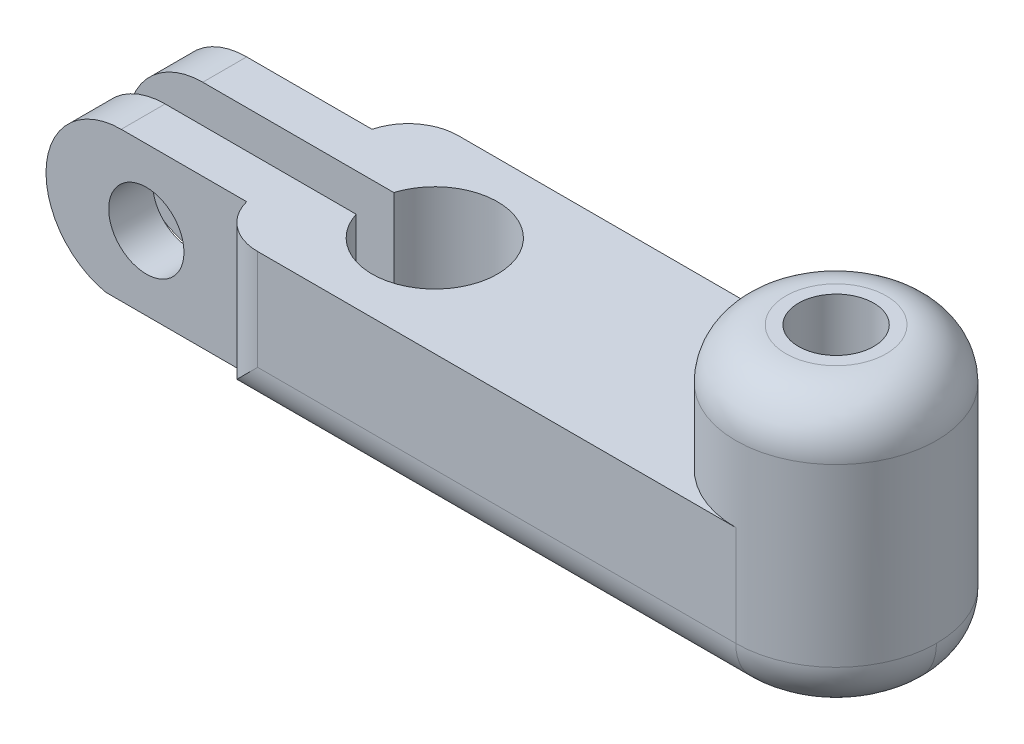
ISO-10303-21;
HEADER;
FILE_DESCRIPTION(('STEP AP214'),'2;1');
FILE_NAME('part.step','',(''),(''),'','','');
FILE_SCHEMA(('AUTOMOTIVE_DESIGN { 1 0 10303 214 1 1 1 1 }'));
ENDSEC;
DATA;
#1=APPLICATION_CONTEXT('core data for automotive mechanical design processes');
#2=APPLICATION_PROTOCOL_DEFINITION('international standard','automotive_design',2000,#1);
#3=PRODUCT_CONTEXT('',#1,'mechanical');
#4=PRODUCT('Part','Part','',(#3));
#5=PRODUCT_RELATED_PRODUCT_CATEGORY('part','',(#4));
#6=PRODUCT_DEFINITION_FORMATION('','',#4);
#7=PRODUCT_DEFINITION_CONTEXT('part definition',#1,'design');
#8=PRODUCT_DEFINITION('design','',#6,#7);
#9=PRODUCT_DEFINITION_SHAPE('','',#8);
#10=(LENGTH_UNIT() NAMED_UNIT(*) SI_UNIT(.MILLI.,.METRE.));
#11=(NAMED_UNIT(*) PLANE_ANGLE_UNIT() SI_UNIT($,.RADIAN.));
#12=(NAMED_UNIT(*) SI_UNIT($,.STERADIAN.) SOLID_ANGLE_UNIT());
#13=UNCERTAINTY_MEASURE_WITH_UNIT(LENGTH_MEASURE(1.E-05),#10,'distance_accuracy_value','');
#14=(GEOMETRIC_REPRESENTATION_CONTEXT(3) GLOBAL_UNCERTAINTY_ASSIGNED_CONTEXT((#13)) GLOBAL_UNIT_ASSIGNED_CONTEXT((#10,
#11,#12)) REPRESENTATION_CONTEXT('',''));
#15=CARTESIAN_POINT('',(0.,0.,0.));
#16=DIRECTION('',(0.,0.,1.));
#17=DIRECTION('',(1.,0.,0.));
#18=AXIS2_PLACEMENT_3D('',#15,#16,#17);
#19=CARTESIAN_POINT('',(0.,0.,0.));
#20=DIRECTION('',(0.,-1.,0.));
#21=DIRECTION('',(0.,0.,-1.));
#22=AXIS2_PLACEMENT_3D('',#19,#20,#21);
#23=PLANE('',#22);
#24=DIRECTION('',(0.,0.,1.));
#25=VECTOR('',#24,1.);
#26=CARTESIAN_POINT('',(-30.,0.,-6.5));
#27=LINE('',#26,#25);
#28=CARTESIAN_POINT('',(-30.,0.,-4.75));
#29=VERTEX_POINT('',#28);
#30=CARTESIAN_POINT('',(-30.,0.,-6.));
#31=VERTEX_POINT('',#30);
#32=EDGE_CURVE('E321',#29,#31,#27,.F.);
#33=ORIENTED_EDGE('',*,*,#32,.T.);
#34=DIRECTION('',(-1.,0.,0.));
#35=VECTOR('',#34,1.);
#36=CARTESIAN_POINT('',(-4.,0.,-6.));
#37=LINE('',#36,#35);
#38=CARTESIAN_POINT('',(-21.5,0.,-6.));
#39=VERTEX_POINT('',#38);
#40=EDGE_CURVE('E323',#31,#39,#37,.F.);
#41=ORIENTED_EDGE('',*,*,#40,.T.);
#42=CARTESIAN_POINT('',(-20.,0.,-4.));
#43=DIRECTION('',(0.,1.,0.));
#44=DIRECTION('',(0.,0.,1.));
#45=AXIS2_PLACEMENT_3D('',#42,#43,#44);
#46=CIRCLE('',#45,2.5);
#47=CARTESIAN_POINT('',(-22.3848480035424,0.,-4.75));
#48=VERTEX_POINT('',#47);
#49=EDGE_CURVE('E380',#39,#48,#46,.T.);
#50=ORIENTED_EDGE('',*,*,#49,.T.);
#51=DIRECTION('',(-1.,0.,0.));
#52=VECTOR('',#51,1.);
#53=CARTESIAN_POINT('',(-33.,0.,-4.75));
#54=LINE('',#53,#52);
#55=EDGE_CURVE('E326',#48,#29,#54,.T.);
#56=ORIENTED_EDGE('',*,*,#55,.T.);
#57=EDGE_LOOP('',(#33,#41,#50,#56));
#58=FACE_BOUND('',#57,.T.);
#59=ADVANCED_FACE('F34',(#58),#23,.T.);
#60=CARTESIAN_POINT('',(-18.5,0.,-2.));
#61=VERTEX_POINT('',#60);
#62=CARTESIAN_POINT('',(-18.5,0.,-6.));
#63=VERTEX_POINT('',#62);
#64=EDGE_CURVE('E379',#61,#63,#46,.T.);
#65=ORIENTED_EDGE('',*,*,#64,.T.);
#66=DIRECTION('',(-1.,0.,0.));
#67=VECTOR('',#66,1.);
#68=CARTESIAN_POINT('',(-4.,0.,-6.));
#69=LINE('',#68,#67);
#70=CARTESIAN_POINT('',(-4.,0.,-6.));
#71=VERTEX_POINT('',#70);
#72=EDGE_CURVE('E336',#63,#71,#69,.F.);
#73=ORIENTED_EDGE('',*,*,#72,.T.);
#74=CARTESIAN_POINT('',(-4.,0.,-4.));
#75=DIRECTION('',(0.,-1.,0.));
#76=DIRECTION('',(0.,0.,-1.));
#77=AXIS2_PLACEMENT_3D('',#74,#75,#76);
#78=CIRCLE('',#77,2.);
#79=CARTESIAN_POINT('',(-2.,0.,-4.));
#80=VERTEX_POINT('',#79);
#81=EDGE_CURVE('E337',#71,#80,#78,.T.);
#82=ORIENTED_EDGE('',*,*,#81,.T.);
#83=CARTESIAN_POINT('',(-4.,0.,-4.));
#84=DIRECTION('',(0.,-1.,0.));
#85=DIRECTION('',(0.,0.,-1.));
#86=AXIS2_PLACEMENT_3D('',#83,#84,#85);
#87=CIRCLE('',#86,2.);
#88=CARTESIAN_POINT('',(-4.,0.,-2.));
#89=VERTEX_POINT('',#88);
#90=EDGE_CURVE('E341',#80,#89,#87,.T.);
#91=ORIENTED_EDGE('',*,*,#90,.T.);
#92=DIRECTION('',(1.,0.,0.));
#93=VECTOR('',#92,1.);
#94=CARTESIAN_POINT('',(-25.,0.,-2.));
#95=LINE('',#94,#93);
#96=EDGE_CURVE('E342',#89,#61,#95,.F.);
#97=ORIENTED_EDGE('',*,*,#96,.T.);
#98=EDGE_LOOP('',(#65,#73,#82,#91,#97));
#99=FACE_BOUND('',#98,.T.);
#100=ADVANCED_FACE('F256',(#99),#23,.T.);
#101=CARTESIAN_POINT('',(0.,6.,0.));
#102=DIRECTION('',(0.,-1.,0.));
#103=DIRECTION('',(0.,0.,-1.));
#104=AXIS2_PLACEMENT_3D('',#101,#102,#103);
#105=PLANE('',#104);
#106=DIRECTION('',(-1.,0.,0.));
#107=VECTOR('',#106,1.);
#108=CARTESIAN_POINT('',(-25.,6.,-8.));
#109=LINE('',#108,#107);
#110=CARTESIAN_POINT('',(-4.,6.,-8.));
#111=VERTEX_POINT('',#110);
#112=CARTESIAN_POINT('',(-23.0635083268963,6.,-8.));
#113=VERTEX_POINT('',#112);
#114=EDGE_CURVE('E399',#111,#113,#109,.T.);
#115=ORIENTED_EDGE('',*,*,#114,.T.);
#116=CARTESIAN_POINT('',(-23.0635083268963,6.,-6.));
#117=DIRECTION('',(0.,-1.,0.));
#118=DIRECTION('',(0.,0.,-1.));
#119=AXIS2_PLACEMENT_3D('',#116,#117,#118);
#120=CIRCLE('',#119,2.);
#121=CARTESIAN_POINT('',(-25.,6.,-6.5));
#122=VERTEX_POINT('',#121);
#123=EDGE_CURVE('E43',#113,#122,#120,.F.);
#124=ORIENTED_EDGE('',*,*,#123,.T.);
#125=DIRECTION('',(-1.,0.,0.));
#126=VECTOR('',#125,1.);
#127=CARTESIAN_POINT('',(-33.,6.,-6.5));
#128=LINE('',#127,#126);
#129=CARTESIAN_POINT('',(-30.,6.,-6.5));
#130=VERTEX_POINT('',#129);
#131=EDGE_CURVE('E403',#122,#130,#128,.T.);
#132=ORIENTED_EDGE('',*,*,#131,.T.);
#133=DIRECTION('',(0.,0.,1.));
#134=VECTOR('',#133,1.);
#135=CARTESIAN_POINT('',(-30.,6.,0.));
#136=LINE('',#135,#134);
#137=CARTESIAN_POINT('',(-30.,6.,-4.75));
#138=VERTEX_POINT('',#137);
#139=EDGE_CURVE('E414',#130,#138,#136,.T.);
#140=ORIENTED_EDGE('',*,*,#139,.T.);
#141=DIRECTION('',(-1.,0.,0.));
#142=VECTOR('',#141,1.);
#143=CARTESIAN_POINT('',(-33.,6.,-4.75));
#144=LINE('',#143,#142);
#145=CARTESIAN_POINT('',(-22.3848480035424,6.,-4.75));
#146=VERTEX_POINT('',#145);
#147=EDGE_CURVE('E394',#146,#138,#144,.T.);
#148=ORIENTED_EDGE('',*,*,#147,.F.);
#149=CARTESIAN_POINT('',(-20.,6.,-4.));
#150=DIRECTION('',(0.,1.,0.));
#151=DIRECTION('',(0.,0.,1.));
#152=AXIS2_PLACEMENT_3D('',#149,#150,#151);
#153=CIRCLE('',#152,2.5);
#154=CARTESIAN_POINT('',(-22.3848480035424,6.,-3.25));
#155=VERTEX_POINT('',#154);
#156=EDGE_CURVE('E390',#155,#146,#153,.T.);
#157=ORIENTED_EDGE('',*,*,#156,.F.);
#158=DIRECTION('',(1.,0.,0.));
#159=VECTOR('',#158,1.);
#160=CARTESIAN_POINT('',(-33.,6.,-3.25));
#161=LINE('',#160,#159);
#162=CARTESIAN_POINT('',(-30.,6.,-3.25));
#163=VERTEX_POINT('',#162);
#164=EDGE_CURVE('E388',#163,#155,#161,.T.);
#165=ORIENTED_EDGE('',*,*,#164,.F.);
#166=DIRECTION('',(0.,0.,1.));
#167=VECTOR('',#166,1.);
#168=CARTESIAN_POINT('',(-30.,6.,0.));
#169=LINE('',#168,#167);
#170=CARTESIAN_POINT('',(-30.,6.,-1.5));
#171=VERTEX_POINT('',#170);
#172=EDGE_CURVE('E421',#163,#171,#169,.T.);
#173=ORIENTED_EDGE('',*,*,#172,.T.);
#174=DIRECTION('',(1.,0.,0.));
#175=VECTOR('',#174,1.);
#176=CARTESIAN_POINT('',(-25.,6.,-1.5));
#177=LINE('',#176,#175);
#178=CARTESIAN_POINT('',(-25.,6.,-1.5));
#179=VERTEX_POINT('',#178);
#180=EDGE_CURVE('E406',#171,#179,#177,.T.);
#181=ORIENTED_EDGE('',*,*,#180,.T.);
#182=CARTESIAN_POINT('',(-23.0635083268963,6.,-2.));
#183=DIRECTION('',(0.,-1.,0.));
#184=DIRECTION('',(0.,0.,-1.));
#185=AXIS2_PLACEMENT_3D('',#182,#183,#184);
#186=CIRCLE('',#185,2.);
#187=CARTESIAN_POINT('',(-23.0635083268963,6.,0.));
#188=VERTEX_POINT('',#187);
#189=EDGE_CURVE('E360',#179,#188,#186,.F.);
#190=ORIENTED_EDGE('',*,*,#189,.T.);
#191=DIRECTION('',(1.,0.,0.));
#192=VECTOR('',#191,1.);
#193=CARTESIAN_POINT('',(-25.,6.,0.));
#194=LINE('',#193,#192);
#195=CARTESIAN_POINT('',(-4.,6.,0.));
#196=VERTEX_POINT('',#195);
#197=EDGE_CURVE('E408',#188,#196,#194,.T.);
#198=ORIENTED_EDGE('',*,*,#197,.T.);
#199=CARTESIAN_POINT('',(-4.,6.,-4.));
#200=DIRECTION('',(0.,1.,0.));
#201=DIRECTION('',(0.,0.,1.));
#202=AXIS2_PLACEMENT_3D('',#199,#200,#201);
#203=CIRCLE('',#202,4.);
#204=EDGE_CURVE('E179',#111,#196,#203,.T.);
#205=ORIENTED_EDGE('',*,*,#204,.F.);
#206=EDGE_LOOP('',(#115,#124,#132,#140,#148,#157,#165,#173,#181,#190,#198,#205));
#207=FACE_BOUND('',#206,.T.);
#208=ADVANCED_FACE('F252',(#207),#105,.F.);
#209=CARTESIAN_POINT('',(-25.,6.,-8.));
#210=DIRECTION('',(0.,0.,1.));
#211=DIRECTION('',(1.,0.,0.));
#212=AXIS2_PLACEMENT_3D('',#209,#210,#211);
#213=PLANE('',#212);
#214=DIRECTION('',(0.,-1.,0.));
#215=VECTOR('',#214,1.);
#216=CARTESIAN_POINT('',(-4.,6.,-8.));
#217=LINE('',#216,#215);
#218=CARTESIAN_POINT('',(-4.,2.,-8.));
#219=VERTEX_POINT('',#218);
#220=EDGE_CURVE('E188',#111,#219,#217,.T.);
#221=ORIENTED_EDGE('',*,*,#220,.T.);
#222=DIRECTION('',(-1.,0.,0.));
#223=VECTOR('',#222,1.);
#224=CARTESIAN_POINT('',(-25.,2.,-8.));
#225=LINE('',#224,#223);
#226=CARTESIAN_POINT('',(-23.0635083268963,2.,-8.));
#227=VERTEX_POINT('',#226);
#228=EDGE_CURVE('E192',#219,#227,#225,.T.);
#229=ORIENTED_EDGE('',*,*,#228,.T.);
#230=DIRECTION('',(0.,-1.,0.));
#231=VECTOR('',#230,1.);
#232=CARTESIAN_POINT('',(-23.0635083268963,6.,-8.));
#233=LINE('',#232,#231);
#234=EDGE_CURVE('E190',#227,#113,#233,.F.);
#235=ORIENTED_EDGE('',*,*,#234,.T.);
#236=ORIENTED_EDGE('',*,*,#114,.F.);
#237=EDGE_LOOP('',(#221,#229,#235,#236));
#238=FACE_BOUND('',#237,.T.);
#239=ADVANCED_FACE('F255',(#238),#213,.F.);
#240=CARTESIAN_POINT('',(-33.,6.,-6.5));
#241=DIRECTION('',(0.,0.,1.));
#242=DIRECTION('',(1.,0.,0.));
#243=AXIS2_PLACEMENT_3D('',#240,#241,#242);
#244=PLANE('',#243);
#245=CARTESIAN_POINT('',(-29.,3.,-6.5));
#246=DIRECTION('',(0.,0.,1.));
#247=DIRECTION('',(1.,0.,0.));
#248=AXIS2_PLACEMENT_3D('',#245,#246,#247);
#249=CIRCLE('',#248,1.5);
#250=CARTESIAN_POINT('',(-27.5,3.,-6.5));
#251=VERTEX_POINT('',#250);
#252=EDGE_CURVE('E391',#251,#251,#249,.T.);
#253=ORIENTED_EDGE('',*,*,#252,.T.);
#254=EDGE_LOOP('',(#253));
#255=FACE_BOUND('',#254,.T.);
#256=DIRECTION('',(0.,-1.,0.));
#257=VECTOR('',#256,1.);
#258=CARTESIAN_POINT('',(-25.,6.,-6.5));
#259=LINE('',#258,#257);
#260=CARTESIAN_POINT('',(-25.,0.0635083268962916,-6.5));
#261=VERTEX_POINT('',#260);
#262=EDGE_CURVE('E412',#122,#261,#259,.T.);
#263=ORIENTED_EDGE('',*,*,#262,.T.);
#264=DIRECTION('',(1.,0.,0.));
#265=VECTOR('',#264,1.);
#266=CARTESIAN_POINT('',(-25.,0.0635083268962913,-6.5));
#267=LINE('',#266,#265);
#268=CARTESIAN_POINT('',(-30.614016818819,0.063508326896292,-6.5));
#269=VERTEX_POINT('',#268);
#270=EDGE_CURVE('E195',#261,#269,#267,.F.);
#271=ORIENTED_EDGE('',*,*,#270,.T.);
#272=CARTESIAN_POINT('',(-30.,3.,-6.5));
#273=DIRECTION('',(0.,0.,1.));
#274=DIRECTION('',(1.,0.,0.));
#275=AXIS2_PLACEMENT_3D('',#272,#273,#274);
#276=CIRCLE('',#275,3.);
#277=CARTESIAN_POINT('',(-33.,3.,-6.5));
#278=VERTEX_POINT('',#277);
#279=EDGE_CURVE('E435',#269,#278,#276,.F.);
#280=ORIENTED_EDGE('',*,*,#279,.T.);
#281=CARTESIAN_POINT('',(-30.,3.,-6.5));
#282=DIRECTION('',(0.,0.,1.));
#283=DIRECTION('',(1.,0.,0.));
#284=AXIS2_PLACEMENT_3D('',#281,#282,#283);
#285=CIRCLE('',#284,3.);
#286=EDGE_CURVE('E329',#278,#130,#285,.F.);
#287=ORIENTED_EDGE('',*,*,#286,.T.);
#288=ORIENTED_EDGE('',*,*,#131,.F.);
#289=EDGE_LOOP('',(#263,#271,#280,#287,#288));
#290=FACE_BOUND('',#289,.T.);
#291=ADVANCED_FACE('F269',(#255,#290),#244,.F.);
#292=CARTESIAN_POINT('',(-25.,6.,-1.5));
#293=DIRECTION('',(0.,0.,-1.));
#294=DIRECTION('',(-1.,0.,0.));
#295=AXIS2_PLACEMENT_3D('',#292,#293,#294);
#296=PLANE('',#295);
#297=CARTESIAN_POINT('',(-29.,3.,-1.5));
#298=DIRECTION('',(0.,0.,1.));
#299=DIRECTION('',(1.,0.,0.));
#300=AXIS2_PLACEMENT_3D('',#297,#298,#299);
#301=CIRCLE('',#300,1.5);
#302=CARTESIAN_POINT('',(-27.5,3.,-1.5));
#303=VERTEX_POINT('',#302);
#304=EDGE_CURVE('E419',#303,#303,#301,.T.);
#305=ORIENTED_EDGE('',*,*,#304,.F.);
#306=EDGE_LOOP('',(#305));
#307=FACE_BOUND('',#306,.T.);
#308=CARTESIAN_POINT('',(-30.,3.,-1.5));
#309=DIRECTION('',(0.,0.,-1.));
#310=DIRECTION('',(-1.,0.,0.));
#311=AXIS2_PLACEMENT_3D('',#308,#309,#310);
#312=CIRCLE('',#311,3.);
#313=CARTESIAN_POINT('',(-33.,3.,-1.5));
#314=VERTEX_POINT('',#313);
#315=CARTESIAN_POINT('',(-30.614016818819,0.063508326896292,-1.5));
#316=VERTEX_POINT('',#315);
#317=EDGE_CURVE('E424',#314,#316,#312,.F.);
#318=ORIENTED_EDGE('',*,*,#317,.T.);
#319=DIRECTION('',(-1.,0.,0.));
#320=VECTOR('',#319,1.);
#321=CARTESIAN_POINT('',(-30.614016818819,0.0635083268962916,-1.5));
#322=LINE('',#321,#320);
#323=CARTESIAN_POINT('',(-25.,0.0635083268962916,-1.5));
#324=VERTEX_POINT('',#323);
#325=EDGE_CURVE('E51',#316,#324,#322,.F.);
#326=ORIENTED_EDGE('',*,*,#325,.T.);
#327=DIRECTION('',(0.,-1.,0.));
#328=VECTOR('',#327,1.);
#329=CARTESIAN_POINT('',(-25.,6.,-1.5));
#330=LINE('',#329,#328);
#331=EDGE_CURVE('E410',#179,#324,#330,.T.);
#332=ORIENTED_EDGE('',*,*,#331,.F.);
#333=ORIENTED_EDGE('',*,*,#180,.F.);
#334=CARTESIAN_POINT('',(-30.,3.,-1.5));
#335=DIRECTION('',(0.,0.,-1.));
#336=DIRECTION('',(-1.,0.,0.));
#337=AXIS2_PLACEMENT_3D('',#334,#335,#336);
#338=CIRCLE('',#337,3.);
#339=EDGE_CURVE('E426',#171,#314,#338,.F.);
#340=ORIENTED_EDGE('',*,*,#339,.T.);
#341=EDGE_LOOP('',(#318,#326,#332,#333,#340));
#342=FACE_BOUND('',#341,.T.);
#343=ADVANCED_FACE('F265',(#307,#342),#296,.F.);
#344=CARTESIAN_POINT('',(-25.,6.,0.));
#345=DIRECTION('',(0.,0.,-1.));
#346=DIRECTION('',(-1.,0.,0.));
#347=AXIS2_PLACEMENT_3D('',#344,#345,#346);
#348=PLANE('',#347);
#349=DIRECTION('',(0.,1.,0.));
#350=VECTOR('',#349,1.);
#351=CARTESIAN_POINT('',(-23.0635083268963,6.,0.));
#352=LINE('',#351,#350);
#353=CARTESIAN_POINT('',(-23.0635083268963,2.,0.));
#354=VERTEX_POINT('',#353);
#355=EDGE_CURVE('E457',#188,#354,#352,.F.);
#356=ORIENTED_EDGE('',*,*,#355,.T.);
#357=DIRECTION('',(1.,0.,0.));
#358=VECTOR('',#357,1.);
#359=CARTESIAN_POINT('',(-4.,2.,0.));
#360=LINE('',#359,#358);
#361=CARTESIAN_POINT('',(-4.,2.,0.));
#362=VERTEX_POINT('',#361);
#363=EDGE_CURVE('E292',#354,#362,#360,.T.);
#364=ORIENTED_EDGE('',*,*,#363,.T.);
#365=DIRECTION('',(0.,-1.,0.));
#366=VECTOR('',#365,1.);
#367=CARTESIAN_POINT('',(-4.,6.,0.));
#368=LINE('',#367,#366);
#369=EDGE_CURVE('E437',#362,#196,#368,.F.);
#370=ORIENTED_EDGE('',*,*,#369,.T.);
#371=ORIENTED_EDGE('',*,*,#197,.F.);
#372=EDGE_LOOP('',(#356,#364,#370,#371));
#373=FACE_BOUND('',#372,.T.);
#374=ADVANCED_FACE('F261',(#373),#348,.F.);
#375=CARTESIAN_POINT('',(-22.3848480035424,0.,-3.25));
#376=VERTEX_POINT('',#375);
#377=CARTESIAN_POINT('',(-21.5,0.,-2.));
#378=VERTEX_POINT('',#377);
#379=EDGE_CURVE('E350',#376,#378,#46,.T.);
#380=ORIENTED_EDGE('',*,*,#379,.T.);
#381=DIRECTION('',(1.,0.,0.));
#382=VECTOR('',#381,1.);
#383=CARTESIAN_POINT('',(-25.,0.,-2.));
#384=LINE('',#383,#382);
#385=CARTESIAN_POINT('',(-30.,0.,-2.));
#386=VERTEX_POINT('',#385);
#387=EDGE_CURVE('E205',#378,#386,#384,.F.);
#388=ORIENTED_EDGE('',*,*,#387,.T.);
#389=DIRECTION('',(0.,0.,1.));
#390=VECTOR('',#389,1.);
#391=CARTESIAN_POINT('',(-30.,0.,-3.25));
#392=LINE('',#391,#390);
#393=CARTESIAN_POINT('',(-30.,0.,-3.25));
#394=VERTEX_POINT('',#393);
#395=EDGE_CURVE('E330',#386,#394,#392,.F.);
#396=ORIENTED_EDGE('',*,*,#395,.T.);
#397=DIRECTION('',(1.,0.,0.));
#398=VECTOR('',#397,1.);
#399=CARTESIAN_POINT('',(-33.,0.,-3.25));
#400=LINE('',#399,#398);
#401=EDGE_CURVE('E382',#394,#376,#400,.T.);
#402=ORIENTED_EDGE('',*,*,#401,.T.);
#403=EDGE_LOOP('',(#380,#388,#396,#402));
#404=FACE_BOUND('',#403,.T.);
#405=ADVANCED_FACE('F258',(#404),#23,.T.);
#406=CARTESIAN_POINT('',(-33.,0.,-4.75));
#407=DIRECTION('',(0.,0.,-1.));
#408=DIRECTION('',(-1.,0.,0.));
#409=AXIS2_PLACEMENT_3D('',#406,#407,#408);
#410=PLANE('',#409);
#411=CARTESIAN_POINT('',(-29.,3.,-4.75));
#412=DIRECTION('',(0.,0.,-1.));
#413=DIRECTION('',(-1.,0.,0.));
#414=AXIS2_PLACEMENT_3D('',#411,#412,#413);
#415=CIRCLE('',#414,1.5);
#416=CARTESIAN_POINT('',(-30.5,3.,-4.75));
#417=VERTEX_POINT('',#416);
#418=EDGE_CURVE('E418',#417,#417,#415,.T.);
#419=ORIENTED_EDGE('',*,*,#418,.T.);
#420=EDGE_LOOP('',(#419));
#421=FACE_BOUND('',#420,.T.);
#422=CARTESIAN_POINT('',(-30.,3.,-4.75));
#423=DIRECTION('',(0.,0.,-1.));
#424=DIRECTION('',(-1.,0.,0.));
#425=AXIS2_PLACEMENT_3D('',#422,#423,#424);
#426=CIRCLE('',#425,3.);
#427=CARTESIAN_POINT('',(-33.,3.,-4.75));
#428=VERTEX_POINT('',#427);
#429=EDGE_CURVE('E431',#138,#428,#426,.F.);
#430=ORIENTED_EDGE('',*,*,#429,.T.);
#431=CARTESIAN_POINT('',(-30.,3.,-4.75));
#432=DIRECTION('',(0.,0.,-1.));
#433=DIRECTION('',(-1.,0.,0.));
#434=AXIS2_PLACEMENT_3D('',#431,#432,#433);
#435=CIRCLE('',#434,3.);
#436=EDGE_CURVE('E355',#428,#29,#435,.F.);
#437=ORIENTED_EDGE('',*,*,#436,.T.);
#438=ORIENTED_EDGE('',*,*,#55,.F.);
#439=DIRECTION('',(0.,1.,0.));
#440=VECTOR('',#439,1.);
#441=CARTESIAN_POINT('',(-22.3848480035424,0.,-4.75));
#442=LINE('',#441,#440);
#443=EDGE_CURVE('E397',#48,#146,#442,.T.);
#444=ORIENTED_EDGE('',*,*,#443,.T.);
#445=ORIENTED_EDGE('',*,*,#147,.T.);
#446=EDGE_LOOP('',(#430,#437,#438,#444,#445));
#447=FACE_BOUND('',#446,.T.);
#448=ADVANCED_FACE('F244',(#421,#447),#410,.F.);
#449=CARTESIAN_POINT('',(-20.,0.,-4.));
#450=DIRECTION('',(0.,1.,0.));
#451=DIRECTION('',(0.,0.,1.));
#452=AXIS2_PLACEMENT_3D('',#449,#450,#451);
#453=CYLINDRICAL_SURFACE('',#452,2.5);
#454=ORIENTED_EDGE('',*,*,#49,.F.);
#455=CARTESIAN_POINT('',(-21.5,0.,-6.));
#456=CARTESIAN_POINT('',(-21.4443543938669,1.08462797515443E-05,-6.04174368089981));
#457=CARTESIAN_POINT('',(-21.3869788673743,0.00130701183339521,-6.08113715573512));
#458=CARTESIAN_POINT('',(-21.2692198680589,0.00566742381643907,-6.154970525643));
#459=CARTESIAN_POINT('',(-21.2088377529029,0.00873087870004243,-6.18941262974843));
#460=CARTESIAN_POINT('',(-21.0854186229261,0.0158275322373335,-6.25315281046661));
#461=CARTESIAN_POINT('',(-21.0223795672234,0.0198614879887059,-6.28244683998635));
#462=CARTESIAN_POINT('',(-20.8940908271499,0.0281879693036921,-6.3356849497495));
#463=CARTESIAN_POINT('',(-20.8288409252643,0.0324805203418074,-6.35962850181385));
#464=CARTESIAN_POINT('',(-20.6965738303863,0.0406987030305064,-6.40200040263483));
#465=CARTESIAN_POINT('',(-20.629557206419,0.0446244510135838,-6.42043050410677));
#466=CARTESIAN_POINT('',(-20.4941784200349,0.0515995972241953,-6.45165511109623));
#467=CARTESIAN_POINT('',(-20.4258162896531,0.05464901628925,-6.46444975061872));
#468=CARTESIAN_POINT('',(-20.2883032822893,0.0594931212815132,-6.48429082097593));
#469=CARTESIAN_POINT('',(-20.2191534826458,0.0612893508100411,-6.49134432517771));
#470=CARTESIAN_POINT('',(-20.0804842162488,0.0634181508880124,-6.49966932431333));
#471=CARTESIAN_POINT('',(-20.0109647549042,0.0637507427950112,-6.50094090361764));
#472=CARTESIAN_POINT('',(-19.8725350416671,0.0629156872287298,-6.49770170409634));
#473=CARTESIAN_POINT('',(-19.8036238228885,0.0617580488901158,-6.49322950384266));
#474=CARTESIAN_POINT('',(-19.6664203567895,0.058095557259847,-6.47860585443695));
#475=CARTESIAN_POINT('',(-19.5981283424611,0.0555902166417897,-6.46845235088383));
#476=CARTESIAN_POINT('',(-19.4626186806258,0.0495284331129608,-6.44253572124454));
#477=CARTESIAN_POINT('',(-19.395401707068,0.0459713561440302,-6.42676921008249));
#478=CARTESIAN_POINT('',(-19.2625269905857,0.0382530466803457,-6.38974868412442));
#479=CARTESIAN_POINT('',(-19.1968698377228,0.0340915896606109,-6.36849262768851));
#480=CARTESIAN_POINT('',(-19.019300627236,0.0225893432388211,-6.30275637280001));
#481=CARTESIAN_POINT('',(-18.9093508704034,0.0151885417472099,-6.25276869507395));
#482=CARTESIAN_POINT('',(-18.7507630963669,0.0067213704374239,-6.16634235273589));
#483=CARTESIAN_POINT('',(-18.698978667269,0.00433846892784258,-6.13564259036949));
#484=CARTESIAN_POINT('',(-18.5977044489988,0.000979622541914516,-6.07055258140544));
#485=CARTESIAN_POINT('',(-18.5482157313092,4.32837214687624E-06,-6.03616063587859));
#486=CARTESIAN_POINT('',(-18.5,0.,-6.));
#487=B_SPLINE_CURVE_WITH_KNOTS('',3,(#455,#456,#457,#458,#459,#460,#461,#462,#463,#464,#465,
#466,#467,#468,#469,#470,#471,#472,#473,#474,#475,#476,#477,#478,#479,#480,#481,#482,#483,#484,
#485,#486),.UNSPECIFIED.,.F.,.F.,(4,2,2,2,2,2,2,2,2,2,2,2,2,2,2,4),(0.,0.208578960228621,
0.417064573115438,0.62571335817783,0.83438273117571,1.04298569791809,1.25158370404781,
1.45992431626934,1.66826188835247,1.87520743442851,2.08222786194397,2.28937335080682,
2.4965959912445,2.85812249285016,3.03872224566038,3.2194054591379),.UNSPECIFIED.);
#488=EDGE_CURVE('E221',#39,#63,#487,.T.);
#489=ORIENTED_EDGE('',*,*,#488,.T.);
#490=ORIENTED_EDGE('',*,*,#64,.F.);
#491=CARTESIAN_POINT('',(-18.5,0.,-2.));
#492=CARTESIAN_POINT('',(-18.5556456061331,1.0846279751798E-05,-1.95825631910019));
#493=CARTESIAN_POINT('',(-18.6130211326257,0.0013070118333954,-1.91886284426488));
#494=CARTESIAN_POINT('',(-18.7307801319411,0.00566742381643898,-1.845029474357));
#495=CARTESIAN_POINT('',(-18.7911622470971,0.00873087870004212,-1.81058737025158));
#496=CARTESIAN_POINT('',(-18.9145813770739,0.015827532237333,-1.74684718953339));
#497=CARTESIAN_POINT('',(-18.9776204327766,0.0198614879887055,-1.71755316001365));
#498=CARTESIAN_POINT('',(-19.1059091728501,0.0281879693036921,-1.6643150502505));
#499=CARTESIAN_POINT('',(-19.1711590747357,0.0324805203418078,-1.64037149818615));
#500=CARTESIAN_POINT('',(-19.3034261696137,0.0406987030305065,-1.59799959736517));
#501=CARTESIAN_POINT('',(-19.370442793581,0.0446244510135834,-1.57956949589324));
#502=CARTESIAN_POINT('',(-19.5058215799651,0.0515995972241948,-1.54834488890377));
#503=CARTESIAN_POINT('',(-19.5741837103469,0.0546490162892499,-1.53555024938128));
#504=CARTESIAN_POINT('',(-19.7116967177107,0.0594931212815134,-1.51570917902407));
#505=CARTESIAN_POINT('',(-19.7808465173542,0.0612893508100412,-1.50865567482229));
#506=CARTESIAN_POINT('',(-19.9195157837512,0.0634181508880126,-1.50033067568667));
#507=CARTESIAN_POINT('',(-19.9890352450958,0.0637507427950116,-1.49905909638236));
#508=CARTESIAN_POINT('',(-20.127464958333,0.0629156872287303,-1.50229829590366));
#509=CARTESIAN_POINT('',(-20.1963761771115,0.0617580488901163,-1.50677049615734));
#510=CARTESIAN_POINT('',(-20.3335796432105,0.0580955572598474,-1.52139414556304));
#511=CARTESIAN_POINT('',(-20.4018716575389,0.0555902166417901,-1.53154764911617));
#512=CARTESIAN_POINT('',(-20.5373813193742,0.0495284331129611,-1.55746427875546));
#513=CARTESIAN_POINT('',(-20.604598292932,0.0459713561440304,-1.5732307899175));
#514=CARTESIAN_POINT('',(-20.7374730094143,0.038253046680346,-1.61025131587558));
#515=CARTESIAN_POINT('',(-20.8031301622772,0.0340915896606112,-1.63150737231149));
#516=CARTESIAN_POINT('',(-20.980699372764,0.0225893432388217,-1.69724362719999));
#517=CARTESIAN_POINT('',(-21.0906491295966,0.0151885417472109,-1.74723130492604));
#518=CARTESIAN_POINT('',(-21.2492369036331,0.00672137043742441,-1.8336576472641));
#519=CARTESIAN_POINT('',(-21.301021332731,0.00433846892784275,-1.86435740963051));
#520=CARTESIAN_POINT('',(-21.4022955510012,0.000979622541914235,-1.92944741859456));
#521=CARTESIAN_POINT('',(-21.4517842686908,4.32837214649156E-06,-1.96383936412141));
#522=CARTESIAN_POINT('',(-21.5,0.,-2.));
#523=B_SPLINE_CURVE_WITH_KNOTS('',3,(#491,#492,#493,#494,#495,#496,#497,#498,#499,#500,#501,
#502,#503,#504,#505,#506,#507,#508,#509,#510,#511,#512,#513,#514,#515,#516,#517,#518,#519,#520,
#521,#522),.UNSPECIFIED.,.F.,.F.,(4,2,2,2,2,2,2,2,2,2,2,2,2,2,2,4),(0.,0.208578960228621,
0.417064573115437,0.625713358177827,0.83438273117571,1.04298569791808,1.2515837040478,
1.45992431626934,1.66826188835248,1.87520743442851,2.08222786194397,2.28937335080683,
2.49659599124451,2.85812249285016,3.03872224566038,3.2194054591379),.UNSPECIFIED.);
#524=EDGE_CURVE('E230',#61,#378,#523,.T.);
#525=ORIENTED_EDGE('',*,*,#524,.T.);
#526=ORIENTED_EDGE('',*,*,#379,.F.);
#527=DIRECTION('',(0.,1.,0.));
#528=VECTOR('',#527,1.);
#529=CARTESIAN_POINT('',(-22.3848480035424,0.,-3.25));
#530=LINE('',#529,#528);
#531=EDGE_CURVE('E387',#376,#155,#530,.T.);
#532=ORIENTED_EDGE('',*,*,#531,.T.);
#533=ORIENTED_EDGE('',*,*,#156,.T.);
#534=ORIENTED_EDGE('',*,*,#443,.F.);
#535=EDGE_LOOP('',(#454,#489,#490,#525,#526,#532,#533,#534));
#536=FACE_BOUND('',#535,.T.);
#537=ADVANCED_FACE('F238',(#536),#453,.F.);
#538=CARTESIAN_POINT('',(-33.,0.,-3.25));
#539=DIRECTION('',(0.,0.,1.));
#540=DIRECTION('',(1.,0.,0.));
#541=AXIS2_PLACEMENT_3D('',#538,#539,#540);
#542=PLANE('',#541);
#543=CARTESIAN_POINT('',(-29.,3.,-3.25));
#544=DIRECTION('',(0.,0.,1.));
#545=DIRECTION('',(1.,0.,0.));
#546=AXIS2_PLACEMENT_3D('',#543,#544,#545);
#547=CIRCLE('',#546,1.5);
#548=CARTESIAN_POINT('',(-27.5,3.,-3.25));
#549=VERTEX_POINT('',#548);
#550=EDGE_CURVE('E415',#549,#549,#547,.T.);
#551=ORIENTED_EDGE('',*,*,#550,.T.);
#552=EDGE_LOOP('',(#551));
#553=FACE_BOUND('',#552,.T.);
#554=CARTESIAN_POINT('',(-30.,3.,-3.25));
#555=DIRECTION('',(0.,0.,1.));
#556=DIRECTION('',(1.,0.,0.));
#557=AXIS2_PLACEMENT_3D('',#554,#555,#556);
#558=CIRCLE('',#557,3.);
#559=CARTESIAN_POINT('',(-33.,3.,-3.25));
#560=VERTEX_POINT('',#559);
#561=EDGE_CURVE('E354',#394,#560,#558,.F.);
#562=ORIENTED_EDGE('',*,*,#561,.T.);
#563=CARTESIAN_POINT('',(-30.,3.,-3.25));
#564=DIRECTION('',(0.,0.,1.));
#565=DIRECTION('',(1.,0.,0.));
#566=AXIS2_PLACEMENT_3D('',#563,#564,#565);
#567=CIRCLE('',#566,3.);
#568=EDGE_CURVE('E429',#560,#163,#567,.F.);
#569=ORIENTED_EDGE('',*,*,#568,.T.);
#570=ORIENTED_EDGE('',*,*,#164,.T.);
#571=ORIENTED_EDGE('',*,*,#531,.F.);
#572=ORIENTED_EDGE('',*,*,#401,.F.);
#573=EDGE_LOOP('',(#562,#569,#570,#571,#572));
#574=FACE_BOUND('',#573,.T.);
#575=ADVANCED_FACE('F243',(#553,#574),#542,.F.);
#576=CARTESIAN_POINT('',(-29.,3.,-8.));
#577=DIRECTION('',(0.,0.,1.));
#578=DIRECTION('',(1.,0.,0.));
#579=AXIS2_PLACEMENT_3D('',#576,#577,#578);
#580=CYLINDRICAL_SURFACE('',#579,1.5);
#581=ORIENTED_EDGE('',*,*,#304,.T.);
#582=EDGE_LOOP('',(#581));
#583=FACE_BOUND('',#582,.T.);
#584=ORIENTED_EDGE('',*,*,#550,.F.);
#585=EDGE_LOOP('',(#584));
#586=FACE_BOUND('',#585,.T.);
#587=ADVANCED_FACE('F250',(#583,#586),#580,.F.);
#588=ORIENTED_EDGE('',*,*,#418,.F.);
#589=EDGE_LOOP('',(#588));
#590=FACE_BOUND('',#589,.T.);
#591=ORIENTED_EDGE('',*,*,#252,.F.);
#592=EDGE_LOOP('',(#591));
#593=FACE_BOUND('',#592,.T.);
#594=ADVANCED_FACE('F284',(#590,#593),#580,.F.);
#595=CARTESIAN_POINT('',(-30.,3.,-1.5));
#596=DIRECTION('',(0.,0.,-1.));
#597=DIRECTION('',(-1.,0.,0.));
#598=AXIS2_PLACEMENT_3D('',#595,#596,#597);
#599=CYLINDRICAL_SURFACE('',#598,3.);
#600=ORIENTED_EDGE('',*,*,#395,.F.);
#601=CARTESIAN_POINT('',(-30.614016818819,0.0635083268962916,-1.5));
#602=CARTESIAN_POINT('',(-30.513609080947,0.0425308095673022,-1.58131724872112));
#603=CARTESIAN_POINT('',(-30.4126793221171,0.0267831985468766,-1.66339043148891));
#604=CARTESIAN_POINT('',(-30.2106496943296,0.00568289879607374,-1.82800885005238));
#605=CARTESIAN_POINT('',(-30.1095513617392,0.000297634523172075,-1.91055178568249));
#606=CARTESIAN_POINT('',(-30.005656828109,4.00620620752572E-06,-1.99538122000919));
#607=CARTESIAN_POINT('',(-30.0028283984088,6.55184581181239E-09,-1.99769062321665));
#608=CARTESIAN_POINT('',(-30.,0.,-2.));
#609=B_SPLINE_CURVE_WITH_KNOTS('',3,(#601,#602,#603,#604,#605,#606,#607,#608),.UNSPECIFIED.,.F.,
.F.,(4,2,2,4),(0.,0.392660035543277,0.784083657527593,0.795038115250398),.UNSPECIFIED.);
#610=EDGE_CURVE('E59',#386,#316,#609,.F.);
#611=ORIENTED_EDGE('',*,*,#610,.T.);
#612=ORIENTED_EDGE('',*,*,#317,.F.);
#613=DIRECTION('',(0.,0.,1.));
#614=VECTOR('',#613,1.);
#615=CARTESIAN_POINT('',(-33.,3.,-1.5));
#616=LINE('',#615,#614);
#617=EDGE_CURVE('E182',#560,#314,#616,.T.);
#618=ORIENTED_EDGE('',*,*,#617,.F.);
#619=ORIENTED_EDGE('',*,*,#561,.F.);
#620=EDGE_LOOP('',(#600,#611,#612,#618,#619));
#621=FACE_BOUND('',#620,.T.);
#622=ADVANCED_FACE('F280',(#621),#599,.T.);
#623=CARTESIAN_POINT('',(-30.,3.,0.));
#624=DIRECTION('',(0.,0.,1.));
#625=DIRECTION('',(1.,0.,0.));
#626=AXIS2_PLACEMENT_3D('',#623,#624,#625);
#627=CYLINDRICAL_SURFACE('',#626,3.);
#628=ORIENTED_EDGE('',*,*,#568,.F.);
#629=ORIENTED_EDGE('',*,*,#617,.T.);
#630=ORIENTED_EDGE('',*,*,#339,.F.);
#631=ORIENTED_EDGE('',*,*,#172,.F.);
#632=EDGE_LOOP('',(#628,#629,#630,#631));
#633=FACE_BOUND('',#632,.T.);
#634=ADVANCED_FACE('F277',(#633),#627,.T.);
#635=CARTESIAN_POINT('',(-30.,3.,0.));
#636=DIRECTION('',(0.,0.,1.));
#637=DIRECTION('',(1.,0.,0.));
#638=AXIS2_PLACEMENT_3D('',#635,#636,#637);
#639=CYLINDRICAL_SURFACE('',#638,3.);
#640=ORIENTED_EDGE('',*,*,#139,.F.);
#641=ORIENTED_EDGE('',*,*,#286,.F.);
#642=DIRECTION('',(0.,0.,1.));
#643=VECTOR('',#642,1.);
#644=CARTESIAN_POINT('',(-33.,3.,-1.5));
#645=LINE('',#644,#643);
#646=EDGE_CURVE('E178',#428,#278,#645,.F.);
#647=ORIENTED_EDGE('',*,*,#646,.F.);
#648=ORIENTED_EDGE('',*,*,#429,.F.);
#649=EDGE_LOOP('',(#640,#641,#647,#648));
#650=FACE_BOUND('',#649,.T.);
#651=ADVANCED_FACE('F279',(#650),#639,.T.);
#652=CARTESIAN_POINT('',(-30.,3.,-1.5));
#653=DIRECTION('',(0.,0.,-1.));
#654=DIRECTION('',(-1.,0.,0.));
#655=AXIS2_PLACEMENT_3D('',#652,#653,#654);
#656=CYLINDRICAL_SURFACE('',#655,3.);
#657=ORIENTED_EDGE('',*,*,#279,.F.);
#658=CARTESIAN_POINT('',(-30.614016818819,0.0635083268962914,-6.5));
#659=CARTESIAN_POINT('',(-30.5136090809477,0.042530809567248,-6.418682751278));
#660=CARTESIAN_POINT('',(-30.4126793221174,0.0267831985468497,-6.33660956851065));
#661=CARTESIAN_POINT('',(-30.2106496943293,0.00568289879610057,-6.17199114994807));
#662=CARTESIAN_POINT('',(-30.1095513617384,0.000297634523225673,-6.08944821431841));
#663=CARTESIAN_POINT('',(-30.005656828109,4.00620620586616E-06,-6.00461877999086));
#664=CARTESIAN_POINT('',(-30.0028283984088,6.5518425847445E-09,-6.00230937678337));
#665=CARTESIAN_POINT('',(-30.,0.,-6.));
#666=B_SPLINE_CURVE_WITH_KNOTS('',3,(#658,#659,#660,#661,#662,#663,#664,#665),.UNSPECIFIED.,.F.,
.F.,(4,2,2,4),(0.,0.392660035543272,0.784083657527596,0.795038115250397),.UNSPECIFIED.);
#667=EDGE_CURVE('E197',#269,#31,#666,.T.);
#668=ORIENTED_EDGE('',*,*,#667,.T.);
#669=ORIENTED_EDGE('',*,*,#32,.F.);
#670=ORIENTED_EDGE('',*,*,#436,.F.);
#671=ORIENTED_EDGE('',*,*,#646,.T.);
#672=EDGE_LOOP('',(#657,#668,#669,#670,#671));
#673=FACE_BOUND('',#672,.T.);
#674=ADVANCED_FACE('F207',(#673),#656,.T.);
#675=CARTESIAN_POINT('',(-4.,6.,-4.));
#676=DIRECTION('',(0.,-1.,0.));
#677=DIRECTION('',(0.,0.,-1.));
#678=AXIS2_PLACEMENT_3D('',#675,#676,#677);
#679=CYLINDRICAL_SURFACE('',#678,4.);
#680=CARTESIAN_POINT('',(-4.,9.,-4.));
#681=DIRECTION('',(0.,1.,0.));
#682=DIRECTION('',(0.,0.,1.));
#683=AXIS2_PLACEMENT_3D('',#680,#681,#682);
#684=CIRCLE('',#683,4.);
#685=CARTESIAN_POINT('',(-4.,9.,0.));
#686=VERTEX_POINT('',#685);
#687=EDGE_CURVE('E229',#686,#686,#684,.F.);
#688=ORIENTED_EDGE('',*,*,#687,.T.);
#689=EDGE_LOOP('',(#688));
#690=FACE_BOUND('',#689,.T.);
#691=DIRECTION('',(0.,-1.,0.));
#692=VECTOR('',#691,1.);
#693=CARTESIAN_POINT('',(0.,6.,-4.));
#694=LINE('',#693,#692);
#695=CARTESIAN_POINT('',(0.,2.,-4.));
#696=VERTEX_POINT('',#695);
#697=CARTESIAN_POINT('',(0.,6.,-4.));
#698=VERTEX_POINT('',#697);
#699=EDGE_CURVE('E172',#696,#698,#694,.F.);
#700=ORIENTED_EDGE('',*,*,#699,.F.);
#701=CARTESIAN_POINT('',(-4.,2.,-4.));
#702=DIRECTION('',(0.,-1.,0.));
#703=DIRECTION('',(0.,0.,-1.));
#704=AXIS2_PLACEMENT_3D('',#701,#702,#703);
#705=CIRCLE('',#704,4.);
#706=EDGE_CURVE('E449',#696,#219,#705,.F.);
#707=ORIENTED_EDGE('',*,*,#706,.T.);
#708=ORIENTED_EDGE('',*,*,#220,.F.);
#709=ORIENTED_EDGE('',*,*,#204,.T.);
#710=ORIENTED_EDGE('',*,*,#369,.F.);
#711=CARTESIAN_POINT('',(-4.,2.,-4.));
#712=DIRECTION('',(0.,-1.,0.));
#713=DIRECTION('',(0.,0.,-1.));
#714=AXIS2_PLACEMENT_3D('',#711,#712,#713);
#715=CIRCLE('',#714,4.);
#716=EDGE_CURVE('E177',#362,#696,#715,.F.);
#717=ORIENTED_EDGE('',*,*,#716,.T.);
#718=ORIENTED_EDGE('',*,*,#699,.T.);
#719=EDGE_LOOP('',(#700,#707,#708,#709,#710,#717,#718));
#720=FACE_BOUND('',#719,.T.);
#721=ADVANCED_FACE('F173',(#690,#720),#679,.T.);
#722=CARTESIAN_POINT('',(-4.,11.,-4.));
#723=DIRECTION('',(0.,1.,0.));
#724=DIRECTION('',(0.,0.,1.));
#725=AXIS2_PLACEMENT_3D('',#722,#723,#724);
#726=PLANE('',#725);
#727=CARTESIAN_POINT('',(-4.,11.,-4.));
#728=DIRECTION('',(0.,1.,0.));
#729=DIRECTION('',(0.,0.,1.));
#730=AXIS2_PLACEMENT_3D('',#727,#728,#729);
#731=CIRCLE('',#730,1.5);
#732=CARTESIAN_POINT('',(-4.,11.,-2.5));
#733=VERTEX_POINT('',#732);
#734=EDGE_CURVE('E496',#733,#733,#731,.T.);
#735=ORIENTED_EDGE('',*,*,#734,.F.);
#736=EDGE_LOOP('',(#735));
#737=FACE_BOUND('',#736,.T.);
#738=CARTESIAN_POINT('',(-4.,11.,-4.));
#739=DIRECTION('',(0.,1.,0.));
#740=DIRECTION('',(0.,0.,1.));
#741=AXIS2_PLACEMENT_3D('',#738,#739,#740);
#742=CIRCLE('',#741,2.);
#743=CARTESIAN_POINT('',(-4.,11.,-2.));
#744=VERTEX_POINT('',#743);
#745=EDGE_CURVE('E11',#744,#744,#742,.T.);
#746=ORIENTED_EDGE('',*,*,#745,.T.);
#747=EDGE_LOOP('',(#746));
#748=FACE_BOUND('',#747,.T.);
#749=ADVANCED_FACE('F304',(#737,#748),#726,.T.);
#750=CARTESIAN_POINT('',(-23.0635083268963,6.,-2.));
#751=DIRECTION('',(0.,1.,0.));
#752=DIRECTION('',(0.,0.,1.));
#753=AXIS2_PLACEMENT_3D('',#750,#751,#752);
#754=CYLINDRICAL_SURFACE('',#753,2.);
#755=ORIENTED_EDGE('',*,*,#189,.F.);
#756=ORIENTED_EDGE('',*,*,#331,.T.);
#757=CARTESIAN_POINT('',(-23.0635083268963,2.,-2.));
#758=DIRECTION('',(-0.707106781186547,0.707106781186547,0.));
#759=DIRECTION('',(0.707106781186547,0.707106781186547,0.));
#760=AXIS2_PLACEMENT_3D('',#757,#758,#759);
#761=ELLIPSE('',#760,2.82842712474619,2.);
#762=EDGE_CURVE('E38',#354,#324,#761,.F.);
#763=ORIENTED_EDGE('',*,*,#762,.F.);
#764=ORIENTED_EDGE('',*,*,#355,.F.);
#765=EDGE_LOOP('',(#755,#756,#763,#764));
#766=FACE_BOUND('',#765,.T.);
#767=ADVANCED_FACE('F300',(#766),#754,.T.);
#768=CARTESIAN_POINT('',(-25.,2.,-2.));
#769=DIRECTION('',(-1.,0.,0.));
#770=DIRECTION('',(0.,0.,1.));
#771=AXIS2_PLACEMENT_3D('',#768,#769,#770);
#772=CYLINDRICAL_SURFACE('',#771,2.);
#773=ORIENTED_EDGE('',*,*,#524,.F.);
#774=ORIENTED_EDGE('',*,*,#96,.F.);
#775=CARTESIAN_POINT('',(-4.,2.,-2.));
#776=DIRECTION('',(1.,0.,0.));
#777=DIRECTION('',(0.,0.,-1.));
#778=AXIS2_PLACEMENT_3D('',#775,#776,#777);
#779=CIRCLE('',#778,2.);
#780=EDGE_CURVE('E372',#362,#89,#779,.T.);
#781=ORIENTED_EDGE('',*,*,#780,.F.);
#782=ORIENTED_EDGE('',*,*,#363,.F.);
#783=ORIENTED_EDGE('',*,*,#762,.T.);
#784=ORIENTED_EDGE('',*,*,#325,.F.);
#785=ORIENTED_EDGE('',*,*,#610,.F.);
#786=ORIENTED_EDGE('',*,*,#387,.F.);
#787=EDGE_LOOP('',(#773,#774,#781,#782,#783,#784,#785,#786));
#788=FACE_BOUND('',#787,.T.);
#789=ADVANCED_FACE('F295',(#788),#772,.T.);
#790=CARTESIAN_POINT('',(-4.,2.,-4.));
#791=DIRECTION('',(0.,-1.,0.));
#792=DIRECTION('',(0.,0.,-1.));
#793=AXIS2_PLACEMENT_3D('',#790,#791,#792);
#794=DEGENERATE_TOROIDAL_SURFACE('',#793,2.,2.,.T.);
#795=ORIENTED_EDGE('',*,*,#780,.T.);
#796=ORIENTED_EDGE('',*,*,#90,.F.);
#797=CARTESIAN_POINT('',(-2.,2.,-4.));
#798=DIRECTION('',(0.,0.,-1.));
#799=DIRECTION('',(-1.,0.,0.));
#800=AXIS2_PLACEMENT_3D('',#797,#798,#799);
#801=CIRCLE('',#800,2.);
#802=EDGE_CURVE('E370',#696,#80,#801,.T.);
#803=ORIENTED_EDGE('',*,*,#802,.F.);
#804=ORIENTED_EDGE('',*,*,#716,.F.);
#805=EDGE_LOOP('',(#795,#796,#803,#804));
#806=FACE_BOUND('',#805,.T.);
#807=ADVANCED_FACE('F299',(#806),#794,.T.);
#808=CARTESIAN_POINT('',(-4.,2.,-4.));
#809=DIRECTION('',(0.,-1.,0.));
#810=DIRECTION('',(0.,0.,-1.));
#811=AXIS2_PLACEMENT_3D('',#808,#809,#810);
#812=DEGENERATE_TOROIDAL_SURFACE('',#811,2.,2.,.T.);
#813=ORIENTED_EDGE('',*,*,#802,.T.);
#814=ORIENTED_EDGE('',*,*,#81,.F.);
#815=CARTESIAN_POINT('',(-4.,2.,-6.));
#816=DIRECTION('',(-1.,0.,0.));
#817=DIRECTION('',(0.,0.,1.));
#818=AXIS2_PLACEMENT_3D('',#815,#816,#817);
#819=CIRCLE('',#818,2.);
#820=EDGE_CURVE('E366',#219,#71,#819,.T.);
#821=ORIENTED_EDGE('',*,*,#820,.F.);
#822=ORIENTED_EDGE('',*,*,#706,.F.);
#823=EDGE_LOOP('',(#813,#814,#821,#822));
#824=FACE_BOUND('',#823,.T.);
#825=ADVANCED_FACE('F448',(#824),#812,.T.);
#826=CARTESIAN_POINT('',(-23.0635083268963,6.,-6.));
#827=DIRECTION('',(0.,-1.,0.));
#828=DIRECTION('',(0.,0.,-1.));
#829=AXIS2_PLACEMENT_3D('',#826,#827,#828);
#830=CYLINDRICAL_SURFACE('',#829,2.);
#831=ORIENTED_EDGE('',*,*,#123,.F.);
#832=ORIENTED_EDGE('',*,*,#234,.F.);
#833=CARTESIAN_POINT('',(-23.0635083268963,2.,-6.));
#834=DIRECTION('',(0.707106781186547,-0.707106781186547,0.));
#835=DIRECTION('',(-0.707106781186547,-0.707106781186547,0.));
#836=AXIS2_PLACEMENT_3D('',#833,#834,#835);
#837=ELLIPSE('',#836,2.82842712474619,2.);
#838=EDGE_CURVE('E364',#261,#227,#837,.T.);
#839=ORIENTED_EDGE('',*,*,#838,.F.);
#840=ORIENTED_EDGE('',*,*,#262,.F.);
#841=EDGE_LOOP('',(#831,#832,#839,#840));
#842=FACE_BOUND('',#841,.T.);
#843=ADVANCED_FACE('F216',(#842),#830,.T.);
#844=CARTESIAN_POINT('',(-25.,2.,-6.));
#845=DIRECTION('',(1.,0.,0.));
#846=DIRECTION('',(0.,0.,-1.));
#847=AXIS2_PLACEMENT_3D('',#844,#845,#846);
#848=CYLINDRICAL_SURFACE('',#847,2.);
#849=ORIENTED_EDGE('',*,*,#488,.F.);
#850=ORIENTED_EDGE('',*,*,#40,.F.);
#851=ORIENTED_EDGE('',*,*,#667,.F.);
#852=ORIENTED_EDGE('',*,*,#270,.F.);
#853=ORIENTED_EDGE('',*,*,#838,.T.);
#854=ORIENTED_EDGE('',*,*,#228,.F.);
#855=ORIENTED_EDGE('',*,*,#820,.T.);
#856=ORIENTED_EDGE('',*,*,#72,.F.);
#857=EDGE_LOOP('',(#849,#850,#851,#852,#853,#854,#855,#856));
#858=FACE_BOUND('',#857,.T.);
#859=ADVANCED_FACE('F211',(#858),#848,.T.);
#860=CARTESIAN_POINT('',(-4.,9.,-4.));
#861=DIRECTION('',(0.,1.,0.));
#862=DIRECTION('',(0.,0.,1.));
#863=AXIS2_PLACEMENT_3D('',#860,#861,#862);
#864=DEGENERATE_TOROIDAL_SURFACE('',#863,2.,2.,.T.);
#865=ORIENTED_EDGE('',*,*,#687,.F.);
#866=EDGE_LOOP('',(#865));
#867=FACE_BOUND('',#866,.T.);
#868=ORIENTED_EDGE('',*,*,#745,.F.);
#869=EDGE_LOOP('',(#868));
#870=FACE_BOUND('',#869,.T.);
#871=ADVANCED_FACE('F36',(#867,#870),#864,.T.);
#872=CARTESIAN_POINT('',(-4.,3.,-4.));
#873=DIRECTION('',(0.,1.,0.));
#874=DIRECTION('',(0.,0.,1.));
#875=AXIS2_PLACEMENT_3D('',#872,#873,#874);
#876=CYLINDRICAL_SURFACE('',#875,1.5);
#877=CARTESIAN_POINT('',(-4.,3.,-4.));
#878=DIRECTION('',(0.,1.,0.));
#879=DIRECTION('',(0.,0.,1.));
#880=AXIS2_PLACEMENT_3D('',#877,#878,#879);
#881=CIRCLE('',#880,1.5);
#882=CARTESIAN_POINT('',(-4.,3.,-2.5));
#883=VERTEX_POINT('',#882);
#884=EDGE_CURVE('E367',#883,#883,#881,.T.);
#885=ORIENTED_EDGE('',*,*,#884,.F.);
#886=EDGE_LOOP('',(#885));
#887=FACE_BOUND('',#886,.T.);
#888=ORIENTED_EDGE('',*,*,#734,.T.);
#889=EDGE_LOOP('',(#888));
#890=FACE_BOUND('',#889,.T.);
#891=ADVANCED_FACE('F465',(#887,#890),#876,.F.);
#892=CARTESIAN_POINT('',(-4.,3.,-4.));
#893=DIRECTION('',(0.,1.,0.));
#894=DIRECTION('',(0.,0.,1.));
#895=AXIS2_PLACEMENT_3D('',#892,#893,#894);
#896=PLANE('',#895);
#897=ORIENTED_EDGE('',*,*,#884,.T.);
#898=EDGE_LOOP('',(#897));
#899=FACE_BOUND('',#898,.T.);
#900=ADVANCED_FACE('F471',(#899),#896,.T.);
#901=CLOSED_SHELL('',(#59,#100,#208,#239,#291,#343,#374,#405,#448,#537,#575,#587,#594,#622,#634,
#651,#674,#721,#749,#767,#789,#807,#825,#843,#859,#871,#891,#900));
#902=MANIFOLD_SOLID_BREP('B2',#901);
#903=ADVANCED_BREP_SHAPE_REPRESENTATION('',(#18,#902),#14);
#904=SHAPE_DEFINITION_REPRESENTATION(#9,#903);
ENDSEC;
END-ISO-10303-21;
